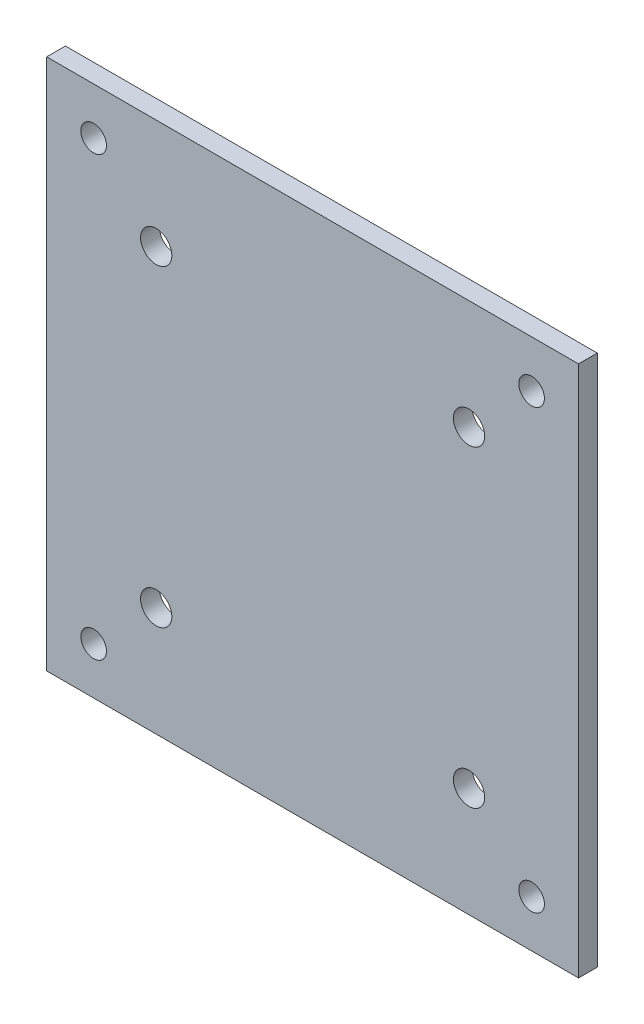
ISO-10303-21;
HEADER;
FILE_DESCRIPTION(('STEP AP214'),'2;1');
FILE_NAME('part.step','',(''),(''),'','','');
FILE_SCHEMA(('AUTOMOTIVE_DESIGN { 1 0 10303 214 1 1 1 1 }'));
ENDSEC;
DATA;
#1=APPLICATION_CONTEXT('core data for automotive mechanical design processes');
#2=APPLICATION_PROTOCOL_DEFINITION('international standard','automotive_design',2000,#1);
#3=PRODUCT_CONTEXT('',#1,'mechanical');
#4=PRODUCT('Part','Part','',(#3));
#5=PRODUCT_RELATED_PRODUCT_CATEGORY('part','',(#4));
#6=PRODUCT_DEFINITION_FORMATION('','',#4);
#7=PRODUCT_DEFINITION_CONTEXT('part definition',#1,'design');
#8=PRODUCT_DEFINITION('design','',#6,#7);
#9=PRODUCT_DEFINITION_SHAPE('','',#8);
#10=(LENGTH_UNIT() NAMED_UNIT(*) SI_UNIT(.MILLI.,.METRE.));
#11=(NAMED_UNIT(*) PLANE_ANGLE_UNIT() SI_UNIT($,.RADIAN.));
#12=(NAMED_UNIT(*) SI_UNIT($,.STERADIAN.) SOLID_ANGLE_UNIT());
#13=UNCERTAINTY_MEASURE_WITH_UNIT(LENGTH_MEASURE(1.E-05),#10,'distance_accuracy_value','');
#14=(GEOMETRIC_REPRESENTATION_CONTEXT(3) GLOBAL_UNCERTAINTY_ASSIGNED_CONTEXT((#13)) GLOBAL_UNIT_ASSIGNED_CONTEXT((#10,
#11,#12)) REPRESENTATION_CONTEXT('',''));
#15=CARTESIAN_POINT('',(0.,0.,0.));
#16=DIRECTION('',(0.,0.,1.));
#17=DIRECTION('',(1.,0.,0.));
#18=AXIS2_PLACEMENT_3D('',#15,#16,#17);
#19=CARTESIAN_POINT('',(42.5,42.5,0.));
#20=DIRECTION('',(1.,0.,0.));
#21=DIRECTION('',(0.,1.,0.));
#22=AXIS2_PLACEMENT_3D('',#19,#20,#21);
#23=PLANE('',#22);
#24=DIRECTION('',(0.,1.,0.));
#25=VECTOR('',#24,1.);
#26=CARTESIAN_POINT('',(42.5,42.5,3.));
#27=LINE('',#26,#25);
#28=CARTESIAN_POINT('',(42.5,-42.5,3.));
#29=VERTEX_POINT('',#28);
#30=CARTESIAN_POINT('',(42.5,42.5,3.));
#31=VERTEX_POINT('',#30);
#32=EDGE_CURVE('E106',#29,#31,#27,.T.);
#33=ORIENTED_EDGE('',*,*,#32,.F.);
#34=DIRECTION('',(0.,0.,1.));
#35=VECTOR('',#34,1.);
#36=CARTESIAN_POINT('',(42.5,-42.5,0.));
#37=LINE('',#36,#35);
#38=CARTESIAN_POINT('',(42.5,-42.5,0.));
#39=VERTEX_POINT('',#38);
#40=EDGE_CURVE('E12',#39,#29,#37,.T.);
#41=ORIENTED_EDGE('',*,*,#40,.F.);
#42=DIRECTION('',(0.,1.,0.));
#43=VECTOR('',#42,1.);
#44=CARTESIAN_POINT('',(42.5,42.5,0.));
#45=LINE('',#44,#43);
#46=CARTESIAN_POINT('',(42.5,42.5,0.));
#47=VERTEX_POINT('',#46);
#48=EDGE_CURVE('E99',#39,#47,#45,.T.);
#49=ORIENTED_EDGE('',*,*,#48,.T.);
#50=DIRECTION('',(0.,0.,1.));
#51=VECTOR('',#50,1.);
#52=CARTESIAN_POINT('',(42.5,42.5,0.));
#53=LINE('',#52,#51);
#54=EDGE_CURVE('E45',#47,#31,#53,.T.);
#55=ORIENTED_EDGE('',*,*,#54,.T.);
#56=EDGE_LOOP('',(#33,#41,#49,#55));
#57=FACE_BOUND('',#56,.T.);
#58=ADVANCED_FACE('F41',(#57),#23,.T.);
#59=CARTESIAN_POINT('',(-42.5,-42.5,0.));
#60=DIRECTION('',(0.,-1.,0.));
#61=DIRECTION('',(0.,0.,-1.));
#62=AXIS2_PLACEMENT_3D('',#59,#60,#61);
#63=PLANE('',#62);
#64=DIRECTION('',(1.,0.,0.));
#65=VECTOR('',#64,1.);
#66=CARTESIAN_POINT('',(-42.5,-42.5,3.));
#67=LINE('',#66,#65);
#68=CARTESIAN_POINT('',(-42.5,-42.5,3.));
#69=VERTEX_POINT('',#68);
#70=EDGE_CURVE('E101',#69,#29,#67,.T.);
#71=ORIENTED_EDGE('',*,*,#70,.F.);
#72=DIRECTION('',(0.,0.,1.));
#73=VECTOR('',#72,1.);
#74=CARTESIAN_POINT('',(-42.5,-42.5,0.));
#75=LINE('',#74,#73);
#76=CARTESIAN_POINT('',(-42.5,-42.5,0.));
#77=VERTEX_POINT('',#76);
#78=EDGE_CURVE('E51',#77,#69,#75,.T.);
#79=ORIENTED_EDGE('',*,*,#78,.F.);
#80=DIRECTION('',(1.,0.,0.));
#81=VECTOR('',#80,1.);
#82=CARTESIAN_POINT('',(-42.5,-42.5,0.));
#83=LINE('',#82,#81);
#84=EDGE_CURVE('E96',#77,#39,#83,.T.);
#85=ORIENTED_EDGE('',*,*,#84,.T.);
#86=ORIENTED_EDGE('',*,*,#40,.T.);
#87=EDGE_LOOP('',(#71,#79,#85,#86));
#88=FACE_BOUND('',#87,.T.);
#89=ADVANCED_FACE('F127',(#88),#63,.T.);
#90=CARTESIAN_POINT('',(-42.5,42.5,0.));
#91=DIRECTION('',(-1.,0.,0.));
#92=DIRECTION('',(0.,-1.,0.));
#93=AXIS2_PLACEMENT_3D('',#90,#91,#92);
#94=PLANE('',#93);
#95=DIRECTION('',(0.,-1.,0.));
#96=VECTOR('',#95,1.);
#97=CARTESIAN_POINT('',(-42.5,42.5,3.));
#98=LINE('',#97,#96);
#99=CARTESIAN_POINT('',(-42.5,42.5,3.));
#100=VERTEX_POINT('',#99);
#101=EDGE_CURVE('E92',#100,#69,#98,.T.);
#102=ORIENTED_EDGE('',*,*,#101,.F.);
#103=DIRECTION('',(0.,0.,1.));
#104=VECTOR('',#103,1.);
#105=CARTESIAN_POINT('',(-42.5,42.5,0.));
#106=LINE('',#105,#104);
#107=CARTESIAN_POINT('',(-42.5,42.5,0.));
#108=VERTEX_POINT('',#107);
#109=EDGE_CURVE('E87',#108,#100,#106,.T.);
#110=ORIENTED_EDGE('',*,*,#109,.F.);
#111=DIRECTION('',(0.,-1.,0.));
#112=VECTOR('',#111,1.);
#113=CARTESIAN_POINT('',(-42.5,42.5,0.));
#114=LINE('',#113,#112);
#115=EDGE_CURVE('E90',#108,#77,#114,.T.);
#116=ORIENTED_EDGE('',*,*,#115,.T.);
#117=ORIENTED_EDGE('',*,*,#78,.T.);
#118=EDGE_LOOP('',(#102,#110,#116,#117));
#119=FACE_BOUND('',#118,.T.);
#120=ADVANCED_FACE('F89',(#119),#94,.T.);
#121=CARTESIAN_POINT('',(-42.5,42.5,0.));
#122=DIRECTION('',(0.,1.,0.));
#123=DIRECTION('',(0.,0.,1.));
#124=AXIS2_PLACEMENT_3D('',#121,#122,#123);
#125=PLANE('',#124);
#126=DIRECTION('',(-1.,0.,0.));
#127=VECTOR('',#126,1.);
#128=CARTESIAN_POINT('',(-42.5,42.5,3.));
#129=LINE('',#128,#127);
#130=EDGE_CURVE('E111',#31,#100,#129,.T.);
#131=ORIENTED_EDGE('',*,*,#130,.F.);
#132=ORIENTED_EDGE('',*,*,#54,.F.);
#133=DIRECTION('',(-1.,0.,0.));
#134=VECTOR('',#133,1.);
#135=CARTESIAN_POINT('',(-42.5,42.5,0.));
#136=LINE('',#135,#134);
#137=EDGE_CURVE('E95',#47,#108,#136,.T.);
#138=ORIENTED_EDGE('',*,*,#137,.T.);
#139=ORIENTED_EDGE('',*,*,#109,.T.);
#140=EDGE_LOOP('',(#131,#132,#138,#139));
#141=FACE_BOUND('',#140,.T.);
#142=ADVANCED_FACE('F98',(#141),#125,.T.);
#143=CARTESIAN_POINT('',(-35.,35.,0.));
#144=DIRECTION('',(0.,0.,1.));
#145=DIRECTION('',(1.,0.,0.));
#146=AXIS2_PLACEMENT_3D('',#143,#144,#145);
#147=CYLINDRICAL_SURFACE('',#146,2.04999999999999);
#148=CARTESIAN_POINT('',(-35.,35.,0.));
#149=DIRECTION('',(0.,0.,1.));
#150=DIRECTION('',(1.,0.,0.));
#151=AXIS2_PLACEMENT_3D('',#148,#149,#150);
#152=CIRCLE('',#151,2.04999999999999);
#153=CARTESIAN_POINT('',(-32.95,35.,0.));
#154=VERTEX_POINT('',#153);
#155=EDGE_CURVE('E112',#154,#154,#152,.T.);
#156=ORIENTED_EDGE('',*,*,#155,.F.);
#157=EDGE_LOOP('',(#156));
#158=FACE_BOUND('',#157,.T.);
#159=CARTESIAN_POINT('',(-35.,35.,3.));
#160=DIRECTION('',(0.,0.,1.));
#161=DIRECTION('',(1.,0.,0.));
#162=AXIS2_PLACEMENT_3D('',#159,#160,#161);
#163=CIRCLE('',#162,2.04999999999999);
#164=CARTESIAN_POINT('',(-32.95,35.,3.));
#165=VERTEX_POINT('',#164);
#166=EDGE_CURVE('E183',#165,#165,#163,.T.);
#167=ORIENTED_EDGE('',*,*,#166,.T.);
#168=EDGE_LOOP('',(#167));
#169=FACE_BOUND('',#168,.T.);
#170=ADVANCED_FACE('F137',(#158,#169),#147,.F.);
#171=CARTESIAN_POINT('',(35.,35.,0.));
#172=DIRECTION('',(0.,0.,1.));
#173=DIRECTION('',(1.,0.,0.));
#174=AXIS2_PLACEMENT_3D('',#171,#172,#173);
#175=CYLINDRICAL_SURFACE('',#174,2.04999999999999);
#176=CARTESIAN_POINT('',(35.,35.,0.));
#177=DIRECTION('',(0.,0.,1.));
#178=DIRECTION('',(-1.,0.,0.));
#179=AXIS2_PLACEMENT_3D('',#176,#177,#178);
#180=CIRCLE('',#179,2.04999999999999);
#181=CARTESIAN_POINT('',(32.95,35.,0.));
#182=VERTEX_POINT('',#181);
#183=EDGE_CURVE('E186',#182,#182,#180,.T.);
#184=ORIENTED_EDGE('',*,*,#183,.F.);
#185=EDGE_LOOP('',(#184));
#186=FACE_BOUND('',#185,.T.);
#187=CARTESIAN_POINT('',(35.,35.,3.));
#188=DIRECTION('',(0.,0.,1.));
#189=DIRECTION('',(-1.,0.,0.));
#190=AXIS2_PLACEMENT_3D('',#187,#188,#189);
#191=CIRCLE('',#190,2.04999999999999);
#192=CARTESIAN_POINT('',(32.95,35.,3.));
#193=VERTEX_POINT('',#192);
#194=EDGE_CURVE('E180',#193,#193,#191,.T.);
#195=ORIENTED_EDGE('',*,*,#194,.T.);
#196=EDGE_LOOP('',(#195));
#197=FACE_BOUND('',#196,.T.);
#198=ADVANCED_FACE('F259',(#186,#197),#175,.F.);
#199=CARTESIAN_POINT('',(35.,-35.,0.));
#200=DIRECTION('',(0.,0.,1.));
#201=DIRECTION('',(1.,0.,0.));
#202=AXIS2_PLACEMENT_3D('',#199,#200,#201);
#203=CYLINDRICAL_SURFACE('',#202,2.04999999999999);
#204=CARTESIAN_POINT('',(35.,-35.,0.));
#205=DIRECTION('',(0.,0.,1.));
#206=DIRECTION('',(1.,0.,0.));
#207=AXIS2_PLACEMENT_3D('',#204,#205,#206);
#208=CIRCLE('',#207,2.04999999999999);
#209=CARTESIAN_POINT('',(37.05,-35.,0.));
#210=VERTEX_POINT('',#209);
#211=EDGE_CURVE('E195',#210,#210,#208,.T.);
#212=ORIENTED_EDGE('',*,*,#211,.F.);
#213=EDGE_LOOP('',(#212));
#214=FACE_BOUND('',#213,.T.);
#215=CARTESIAN_POINT('',(35.,-35.,3.));
#216=DIRECTION('',(0.,0.,1.));
#217=DIRECTION('',(1.,0.,0.));
#218=AXIS2_PLACEMENT_3D('',#215,#216,#217);
#219=CIRCLE('',#218,2.04999999999999);
#220=CARTESIAN_POINT('',(37.05,-35.,3.));
#221=VERTEX_POINT('',#220);
#222=EDGE_CURVE('E176',#221,#221,#219,.T.);
#223=ORIENTED_EDGE('',*,*,#222,.T.);
#224=EDGE_LOOP('',(#223));
#225=FACE_BOUND('',#224,.T.);
#226=ADVANCED_FACE('F150',(#214,#225),#203,.F.);
#227=CARTESIAN_POINT('',(-35.,-35.,0.));
#228=DIRECTION('',(0.,0.,1.));
#229=DIRECTION('',(1.,0.,0.));
#230=AXIS2_PLACEMENT_3D('',#227,#228,#229);
#231=CYLINDRICAL_SURFACE('',#230,2.04999999999999);
#232=CARTESIAN_POINT('',(-35.,-35.,0.));
#233=DIRECTION('',(0.,0.,1.));
#234=DIRECTION('',(-1.,0.,0.));
#235=AXIS2_PLACEMENT_3D('',#232,#233,#234);
#236=CIRCLE('',#235,2.04999999999999);
#237=CARTESIAN_POINT('',(-37.05,-35.,0.));
#238=VERTEX_POINT('',#237);
#239=EDGE_CURVE('E204',#238,#238,#236,.T.);
#240=ORIENTED_EDGE('',*,*,#239,.F.);
#241=EDGE_LOOP('',(#240));
#242=FACE_BOUND('',#241,.T.);
#243=CARTESIAN_POINT('',(-35.,-35.,3.));
#244=DIRECTION('',(0.,0.,1.));
#245=DIRECTION('',(-1.,0.,0.));
#246=AXIS2_PLACEMENT_3D('',#243,#244,#245);
#247=CIRCLE('',#246,2.04999999999999);
#248=CARTESIAN_POINT('',(-37.05,-35.,3.));
#249=VERTEX_POINT('',#248);
#250=EDGE_CURVE('E172',#249,#249,#247,.T.);
#251=ORIENTED_EDGE('',*,*,#250,.T.);
#252=EDGE_LOOP('',(#251));
#253=FACE_BOUND('',#252,.T.);
#254=ADVANCED_FACE('F142',(#242,#253),#231,.F.);
#255=CARTESIAN_POINT('',(0.,0.,3.));
#256=DIRECTION('',(0.,0.,1.));
#257=DIRECTION('',(1.,0.,0.));
#258=AXIS2_PLACEMENT_3D('',#255,#256,#257);
#259=PLANE('',#258);
#260=CARTESIAN_POINT('',(25.,-25.,3.));
#261=DIRECTION('',(0.,0.,1.));
#262=DIRECTION('',(1.,0.,0.));
#263=AXIS2_PLACEMENT_3D('',#260,#261,#262);
#264=CIRCLE('',#263,2.5);
#265=CARTESIAN_POINT('',(27.5,-25.,3.));
#266=VERTEX_POINT('',#265);
#267=EDGE_CURVE('E156',#266,#266,#264,.T.);
#268=ORIENTED_EDGE('',*,*,#267,.F.);
#269=EDGE_LOOP('',(#268));
#270=FACE_BOUND('',#269,.T.);
#271=CARTESIAN_POINT('',(-25.,-25.,3.));
#272=DIRECTION('',(0.,0.,1.));
#273=DIRECTION('',(1.,0.,0.));
#274=AXIS2_PLACEMENT_3D('',#271,#272,#273);
#275=CIRCLE('',#274,2.5);
#276=CARTESIAN_POINT('',(-22.5,-25.,3.));
#277=VERTEX_POINT('',#276);
#278=EDGE_CURVE('E160',#277,#277,#275,.T.);
#279=ORIENTED_EDGE('',*,*,#278,.F.);
#280=EDGE_LOOP('',(#279));
#281=FACE_BOUND('',#280,.T.);
#282=CARTESIAN_POINT('',(25.,25.,3.));
#283=DIRECTION('',(0.,0.,1.));
#284=DIRECTION('',(1.,0.,0.));
#285=AXIS2_PLACEMENT_3D('',#282,#283,#284);
#286=CIRCLE('',#285,2.5);
#287=CARTESIAN_POINT('',(27.5,25.,3.));
#288=VERTEX_POINT('',#287);
#289=EDGE_CURVE('E164',#288,#288,#286,.T.);
#290=ORIENTED_EDGE('',*,*,#289,.F.);
#291=EDGE_LOOP('',(#290));
#292=FACE_BOUND('',#291,.T.);
#293=CARTESIAN_POINT('',(-25.,25.,3.));
#294=DIRECTION('',(0.,0.,1.));
#295=DIRECTION('',(1.,0.,0.));
#296=AXIS2_PLACEMENT_3D('',#293,#294,#295);
#297=CIRCLE('',#296,2.5);
#298=CARTESIAN_POINT('',(-22.5,25.,3.));
#299=VERTEX_POINT('',#298);
#300=EDGE_CURVE('E168',#299,#299,#297,.T.);
#301=ORIENTED_EDGE('',*,*,#300,.F.);
#302=EDGE_LOOP('',(#301));
#303=FACE_BOUND('',#302,.T.);
#304=ORIENTED_EDGE('',*,*,#250,.F.);
#305=EDGE_LOOP('',(#304));
#306=FACE_BOUND('',#305,.T.);
#307=ORIENTED_EDGE('',*,*,#222,.F.);
#308=EDGE_LOOP('',(#307));
#309=FACE_BOUND('',#308,.T.);
#310=ORIENTED_EDGE('',*,*,#194,.F.);
#311=EDGE_LOOP('',(#310));
#312=FACE_BOUND('',#311,.T.);
#313=ORIENTED_EDGE('',*,*,#166,.F.);
#314=EDGE_LOOP('',(#313));
#315=FACE_BOUND('',#314,.T.);
#316=ORIENTED_EDGE('',*,*,#32,.T.);
#317=ORIENTED_EDGE('',*,*,#130,.T.);
#318=ORIENTED_EDGE('',*,*,#101,.T.);
#319=ORIENTED_EDGE('',*,*,#70,.T.);
#320=EDGE_LOOP('',(#316,#317,#318,#319));
#321=FACE_BOUND('',#320,.T.);
#322=ADVANCED_FACE('F126',(#270,#281,#292,#303,#306,#309,#312,#315,#321),#259,.T.);
#323=CARTESIAN_POINT('',(0.,0.,0.));
#324=DIRECTION('',(0.,0.,1.));
#325=DIRECTION('',(1.,0.,0.));
#326=AXIS2_PLACEMENT_3D('',#323,#324,#325);
#327=PLANE('',#326);
#328=CARTESIAN_POINT('',(25.,-25.,0.));
#329=DIRECTION('',(0.,0.,1.));
#330=DIRECTION('',(1.,0.,0.));
#331=AXIS2_PLACEMENT_3D('',#328,#329,#330);
#332=CIRCLE('',#331,2.5);
#333=CARTESIAN_POINT('',(27.5,-25.,0.));
#334=VERTEX_POINT('',#333);
#335=EDGE_CURVE('E224',#334,#334,#332,.T.);
#336=ORIENTED_EDGE('',*,*,#335,.T.);
#337=EDGE_LOOP('',(#336));
#338=FACE_BOUND('',#337,.T.);
#339=CARTESIAN_POINT('',(-25.,-25.,0.));
#340=DIRECTION('',(0.,0.,1.));
#341=DIRECTION('',(1.,0.,0.));
#342=AXIS2_PLACEMENT_3D('',#339,#340,#341);
#343=CIRCLE('',#342,2.5);
#344=CARTESIAN_POINT('',(-22.5,-25.,0.));
#345=VERTEX_POINT('',#344);
#346=EDGE_CURVE('E230',#345,#345,#343,.T.);
#347=ORIENTED_EDGE('',*,*,#346,.T.);
#348=EDGE_LOOP('',(#347));
#349=FACE_BOUND('',#348,.T.);
#350=CARTESIAN_POINT('',(25.,25.,0.));
#351=DIRECTION('',(0.,0.,1.));
#352=DIRECTION('',(1.,0.,0.));
#353=AXIS2_PLACEMENT_3D('',#350,#351,#352);
#354=CIRCLE('',#353,2.5);
#355=CARTESIAN_POINT('',(27.5,25.,0.));
#356=VERTEX_POINT('',#355);
#357=EDGE_CURVE('E209',#356,#356,#354,.T.);
#358=ORIENTED_EDGE('',*,*,#357,.T.);
#359=EDGE_LOOP('',(#358));
#360=FACE_BOUND('',#359,.T.);
#361=CARTESIAN_POINT('',(-25.,25.,0.));
#362=DIRECTION('',(0.,0.,1.));
#363=DIRECTION('',(1.,0.,0.));
#364=AXIS2_PLACEMENT_3D('',#361,#362,#363);
#365=CIRCLE('',#364,2.5);
#366=CARTESIAN_POINT('',(-22.5,25.,0.));
#367=VERTEX_POINT('',#366);
#368=EDGE_CURVE('E215',#367,#367,#365,.T.);
#369=ORIENTED_EDGE('',*,*,#368,.T.);
#370=EDGE_LOOP('',(#369));
#371=FACE_BOUND('',#370,.T.);
#372=ORIENTED_EDGE('',*,*,#239,.T.);
#373=EDGE_LOOP('',(#372));
#374=FACE_BOUND('',#373,.T.);
#375=ORIENTED_EDGE('',*,*,#211,.T.);
#376=EDGE_LOOP('',(#375));
#377=FACE_BOUND('',#376,.T.);
#378=ORIENTED_EDGE('',*,*,#183,.T.);
#379=EDGE_LOOP('',(#378));
#380=FACE_BOUND('',#379,.T.);
#381=ORIENTED_EDGE('',*,*,#155,.T.);
#382=EDGE_LOOP('',(#381));
#383=FACE_BOUND('',#382,.T.);
#384=ORIENTED_EDGE('',*,*,#48,.F.);
#385=ORIENTED_EDGE('',*,*,#84,.F.);
#386=ORIENTED_EDGE('',*,*,#115,.F.);
#387=ORIENTED_EDGE('',*,*,#137,.F.);
#388=EDGE_LOOP('',(#384,#385,#386,#387));
#389=FACE_BOUND('',#388,.T.);
#390=ADVANCED_FACE('F43',(#338,#349,#360,#371,#374,#377,#380,#383,#389),#327,.F.);
#391=CARTESIAN_POINT('',(-25.,-25.,0.));
#392=DIRECTION('',(0.,0.,1.));
#393=DIRECTION('',(1.,0.,0.));
#394=AXIS2_PLACEMENT_3D('',#391,#392,#393);
#395=CYLINDRICAL_SURFACE('',#394,2.5);
#396=ORIENTED_EDGE('',*,*,#346,.F.);
#397=EDGE_LOOP('',(#396));
#398=FACE_BOUND('',#397,.T.);
#399=ORIENTED_EDGE('',*,*,#278,.T.);
#400=EDGE_LOOP('',(#399));
#401=FACE_BOUND('',#400,.T.);
#402=ADVANCED_FACE('F148',(#398,#401),#395,.F.);
#403=CARTESIAN_POINT('',(25.,25.,0.));
#404=DIRECTION('',(0.,0.,1.));
#405=DIRECTION('',(1.,0.,0.));
#406=AXIS2_PLACEMENT_3D('',#403,#404,#405);
#407=CYLINDRICAL_SURFACE('',#406,2.5);
#408=ORIENTED_EDGE('',*,*,#357,.F.);
#409=EDGE_LOOP('',(#408));
#410=FACE_BOUND('',#409,.T.);
#411=ORIENTED_EDGE('',*,*,#289,.T.);
#412=EDGE_LOOP('',(#411));
#413=FACE_BOUND('',#412,.T.);
#414=ADVANCED_FACE('F242',(#410,#413),#407,.F.);
#415=CARTESIAN_POINT('',(-25.,25.,0.));
#416=DIRECTION('',(0.,0.,1.));
#417=DIRECTION('',(1.,0.,0.));
#418=AXIS2_PLACEMENT_3D('',#415,#416,#417);
#419=CYLINDRICAL_SURFACE('',#418,2.5);
#420=ORIENTED_EDGE('',*,*,#368,.F.);
#421=EDGE_LOOP('',(#420));
#422=FACE_BOUND('',#421,.T.);
#423=ORIENTED_EDGE('',*,*,#300,.T.);
#424=EDGE_LOOP('',(#423));
#425=FACE_BOUND('',#424,.T.);
#426=ADVANCED_FACE('F247',(#422,#425),#419,.F.);
#427=CARTESIAN_POINT('',(25.,-25.,0.));
#428=DIRECTION('',(0.,0.,1.));
#429=DIRECTION('',(1.,0.,0.));
#430=AXIS2_PLACEMENT_3D('',#427,#428,#429);
#431=CYLINDRICAL_SURFACE('',#430,2.5);
#432=ORIENTED_EDGE('',*,*,#335,.F.);
#433=EDGE_LOOP('',(#432));
#434=FACE_BOUND('',#433,.T.);
#435=ORIENTED_EDGE('',*,*,#267,.T.);
#436=EDGE_LOOP('',(#435));
#437=FACE_BOUND('',#436,.T.);
#438=ADVANCED_FACE('F251',(#434,#437),#431,.F.);
#439=CLOSED_SHELL('',(#58,#89,#120,#142,#170,#198,#226,#254,#322,#390,#402,#414,#426,#438));
#440=MANIFOLD_SOLID_BREP('B2',#439);
#441=ADVANCED_BREP_SHAPE_REPRESENTATION('',(#18,#440),#14);
#442=SHAPE_DEFINITION_REPRESENTATION(#9,#441);
ENDSEC;
END-ISO-10303-21;
